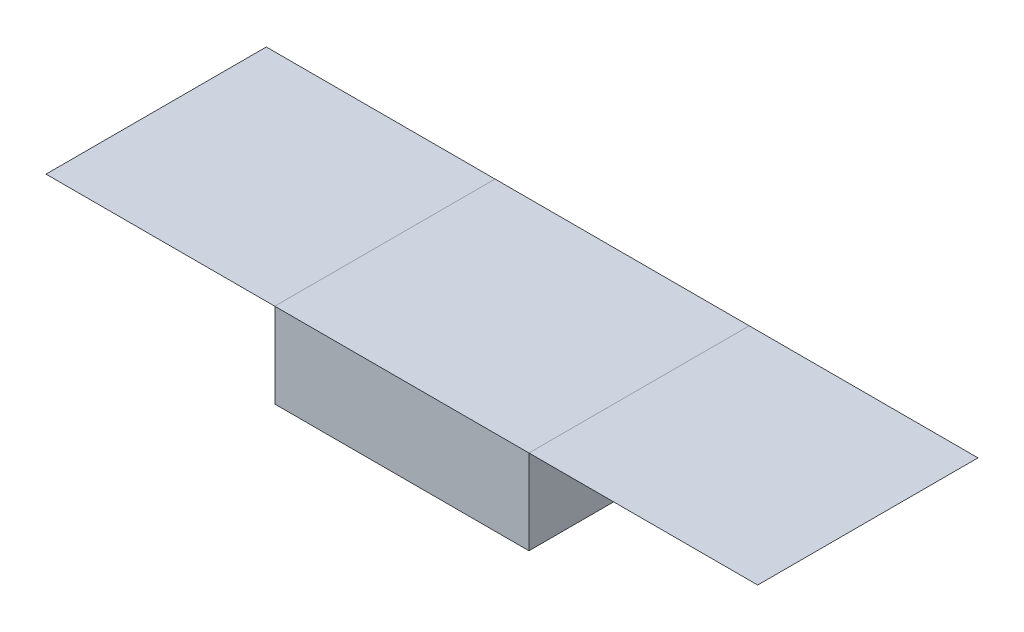
ISO-10303-21;
HEADER;
FILE_DESCRIPTION(('STEP AP214'),'2;1');
FILE_NAME('part.step','',(''),(''),'','','');
FILE_SCHEMA(('AUTOMOTIVE_DESIGN { 1 0 10303 214 1 1 1 1 }'));
ENDSEC;
DATA;
#1=APPLICATION_CONTEXT('core data for automotive mechanical design processes');
#2=APPLICATION_PROTOCOL_DEFINITION('international standard','automotive_design',2000,#1);
#3=PRODUCT_CONTEXT('',#1,'mechanical');
#4=PRODUCT('Part','Part','',(#3));
#5=PRODUCT_RELATED_PRODUCT_CATEGORY('part','',(#4));
#6=PRODUCT_DEFINITION_FORMATION('','',#4);
#7=PRODUCT_DEFINITION_CONTEXT('part definition',#1,'design');
#8=PRODUCT_DEFINITION('design','',#6,#7);
#9=PRODUCT_DEFINITION_SHAPE('','',#8);
#10=(LENGTH_UNIT() NAMED_UNIT(*) SI_UNIT(.MILLI.,.METRE.));
#11=(NAMED_UNIT(*) PLANE_ANGLE_UNIT() SI_UNIT($,.RADIAN.));
#12=(NAMED_UNIT(*) SI_UNIT($,.STERADIAN.) SOLID_ANGLE_UNIT());
#13=UNCERTAINTY_MEASURE_WITH_UNIT(LENGTH_MEASURE(1.E-05),#10,'distance_accuracy_value','');
#14=(GEOMETRIC_REPRESENTATION_CONTEXT(3) GLOBAL_UNCERTAINTY_ASSIGNED_CONTEXT((#13)) GLOBAL_UNIT_ASSIGNED_CONTEXT((#10,
#11,#12)) REPRESENTATION_CONTEXT('',''));
#15=CARTESIAN_POINT('',(0.,0.,0.));
#16=DIRECTION('',(0.,0.,1.));
#17=DIRECTION('',(1.,0.,0.));
#18=AXIS2_PLACEMENT_3D('',#15,#16,#17);
#19=CARTESIAN_POINT('',(21.85,0.,12.5));
#20=DIRECTION('',(0.,-1.,0.));
#21=DIRECTION('',(0.,0.,-1.));
#22=AXIS2_PLACEMENT_3D('',#19,#20,#21);
#23=PLANE('',#22);
#24=DIRECTION('',(0.,0.,-1.));
#25=VECTOR('',#24,1.);
#26=CARTESIAN_POINT('',(11.5,-3.21735518120857E-13,23.7));
#27=LINE('',#26,#25);
#28=CARTESIAN_POINT('',(11.5,-1.60867759060428E-13,23.7));
#29=VERTEX_POINT('',#28);
#30=CARTESIAN_POINT('',(11.5,-1.60867759060428E-13,25.));
#31=VERTEX_POINT('',#30);
#32=EDGE_CURVE('P0_E79',#29,#31,#27,.F.);
#33=ORIENTED_EDGE('',*,*,#32,.F.);
#34=DIRECTION('',(-1.,0.,0.));
#35=VECTOR('',#34,1.);
#36=CARTESIAN_POINT('',(10.,-3.21735518120857E-13,23.7));
#37=LINE('',#36,#35);
#38=CARTESIAN_POINT('',(10.,0.,23.7));
#39=VERTEX_POINT('',#38);
#40=EDGE_CURVE('P0_E55',#39,#29,#37,.F.);
#41=ORIENTED_EDGE('',*,*,#40,.F.);
#42=DIRECTION('',(0.,0.,1.));
#43=VECTOR('',#42,1.);
#44=CARTESIAN_POINT('',(10.,0.,25.));
#45=LINE('',#44,#43);
#46=CARTESIAN_POINT('',(10.,0.,25.));
#47=VERTEX_POINT('',#46);
#48=EDGE_CURVE('P0_E57',#47,#39,#45,.F.);
#49=ORIENTED_EDGE('',*,*,#48,.F.);
#50=DIRECTION('',(1.,0.,0.));
#51=VECTOR('',#50,1.);
#52=CARTESIAN_POINT('',(11.5,-3.21735518120857E-13,25.));
#53=LINE('',#52,#51);
#54=EDGE_CURVE('P0_E20',#31,#47,#53,.F.);
#55=ORIENTED_EDGE('',*,*,#54,.F.);
#56=EDGE_LOOP('',(#33,#41,#49,#55));
#57=FACE_BOUND('',#56,.T.);
#58=ADVANCED_FACE('P0_F17',(#57),#23,.F.);
#59=CARTESIAN_POINT('',(11.5,-3.21735518120857E-13,25.));
#60=DIRECTION('',(0.,0.,1.));
#61=DIRECTION('',(1.,0.,0.));
#62=AXIS2_PLACEMENT_3D('',#59,#60,#61);
#63=PLANE('',#62);
#64=DIRECTION('',(1.,0.,0.));
#65=VECTOR('',#64,1.);
#66=CARTESIAN_POINT('',(21.85,-0.5,25.));
#67=LINE('',#66,#65);
#68=CARTESIAN_POINT('',(11.5,-0.50000000000008,25.));
#69=VERTEX_POINT('',#68);
#70=CARTESIAN_POINT('',(10.,-0.50000000000008,25.));
#71=VERTEX_POINT('',#70);
#72=EDGE_CURVE('P0_E83',#69,#71,#67,.F.);
#73=ORIENTED_EDGE('',*,*,#72,.F.);
#74=DIRECTION('',(0.,1.,0.));
#75=VECTOR('',#74,1.);
#76=CARTESIAN_POINT('',(11.5,-3.21735518120857E-13,25.));
#77=LINE('',#76,#75);
#78=EDGE_CURVE('P0_E68',#31,#69,#77,.F.);
#79=ORIENTED_EDGE('',*,*,#78,.F.);
#80=ORIENTED_EDGE('',*,*,#54,.T.);
#81=DIRECTION('',(0.,1.,0.));
#82=VECTOR('',#81,1.);
#83=CARTESIAN_POINT('',(10.,0.,25.));
#84=LINE('',#83,#82);
#85=EDGE_CURVE('P0_E63',#71,#47,#84,.T.);
#86=ORIENTED_EDGE('',*,*,#85,.F.);
#87=EDGE_LOOP('',(#73,#79,#80,#86));
#88=FACE_BOUND('',#87,.T.);
#89=ADVANCED_FACE('P0_F65',(#88),#63,.T.);
#90=CARTESIAN_POINT('',(10.,0.,25.));
#91=DIRECTION('',(-1.,0.,0.));
#92=DIRECTION('',(0.,0.,1.));
#93=AXIS2_PLACEMENT_3D('',#90,#91,#92);
#94=PLANE('',#93);
#95=DIRECTION('',(0.,0.,-1.));
#96=VECTOR('',#95,1.);
#97=CARTESIAN_POINT('',(10.,-0.5,12.5));
#98=LINE('',#97,#96);
#99=CARTESIAN_POINT('',(10.,-0.500000000000242,23.7));
#100=VERTEX_POINT('',#99);
#101=EDGE_CURVE('P0_E72',#71,#100,#98,.T.);
#102=ORIENTED_EDGE('',*,*,#101,.F.);
#103=ORIENTED_EDGE('',*,*,#85,.T.);
#104=ORIENTED_EDGE('',*,*,#48,.T.);
#105=DIRECTION('',(0.,1.,0.));
#106=VECTOR('',#105,1.);
#107=CARTESIAN_POINT('',(10.,-3.21735518120857E-13,23.7));
#108=LINE('',#107,#106);
#109=EDGE_CURVE('P0_E75',#100,#39,#108,.T.);
#110=ORIENTED_EDGE('',*,*,#109,.F.);
#111=EDGE_LOOP('',(#102,#103,#104,#110));
#112=FACE_BOUND('',#111,.T.);
#113=ADVANCED_FACE('P0_F70',(#112),#94,.T.);
#114=CARTESIAN_POINT('',(10.,-3.21735518120857E-13,23.7));
#115=DIRECTION('',(0.,0.,-1.));
#116=DIRECTION('',(-1.,0.,0.));
#117=AXIS2_PLACEMENT_3D('',#114,#115,#116);
#118=PLANE('',#117);
#119=DIRECTION('',(1.,0.,0.));
#120=VECTOR('',#119,1.);
#121=CARTESIAN_POINT('',(21.85,-0.5,23.7));
#122=LINE('',#121,#120);
#123=CARTESIAN_POINT('',(11.5,-0.500000000000242,23.7));
#124=VERTEX_POINT('',#123);
#125=EDGE_CURVE('P0_E26',#100,#124,#122,.T.);
#126=ORIENTED_EDGE('',*,*,#125,.F.);
#127=ORIENTED_EDGE('',*,*,#109,.T.);
#128=ORIENTED_EDGE('',*,*,#40,.T.);
#129=DIRECTION('',(0.,1.,0.));
#130=VECTOR('',#129,1.);
#131=CARTESIAN_POINT('',(11.5,-3.21735518120857E-13,23.7));
#132=LINE('',#131,#130);
#133=EDGE_CURVE('P0_E35',#124,#29,#132,.T.);
#134=ORIENTED_EDGE('',*,*,#133,.F.);
#135=EDGE_LOOP('',(#126,#127,#128,#134));
#136=FACE_BOUND('',#135,.T.);
#137=ADVANCED_FACE('P0_F89',(#136),#118,.T.);
#138=CARTESIAN_POINT('',(11.5,-3.21735518120857E-13,23.7));
#139=DIRECTION('',(1.,0.,0.));
#140=DIRECTION('',(0.,0.,-1.));
#141=AXIS2_PLACEMENT_3D('',#138,#139,#140);
#142=PLANE('',#141);
#143=DIRECTION('',(0.,0.,-1.));
#144=VECTOR('',#143,1.);
#145=CARTESIAN_POINT('',(11.5,-0.5,12.5));
#146=LINE('',#145,#144);
#147=EDGE_CURVE('P0_E11',#124,#69,#146,.F.);
#148=ORIENTED_EDGE('',*,*,#147,.F.);
#149=ORIENTED_EDGE('',*,*,#133,.T.);
#150=ORIENTED_EDGE('',*,*,#32,.T.);
#151=ORIENTED_EDGE('',*,*,#78,.T.);
#152=EDGE_LOOP('',(#148,#149,#150,#151));
#153=FACE_BOUND('',#152,.T.);
#154=ADVANCED_FACE('P0_F91',(#153),#142,.T.);
#155=CARTESIAN_POINT('',(21.85,-0.5,12.5));
#156=DIRECTION('',(0.,-1.,0.));
#157=DIRECTION('',(0.,0.,-1.));
#158=AXIS2_PLACEMENT_3D('',#155,#156,#157);
#159=PLANE('',#158);
#160=ORIENTED_EDGE('',*,*,#125,.T.);
#161=ORIENTED_EDGE('',*,*,#147,.T.);
#162=ORIENTED_EDGE('',*,*,#72,.T.);
#163=ORIENTED_EDGE('',*,*,#101,.T.);
#164=EDGE_LOOP('',(#160,#161,#162,#163));
#165=FACE_BOUND('',#164,.T.);
#166=ADVANCED_FACE('P0_F88',(#165),#159,.T.);
#167=CLOSED_SHELL('',(#58,#89,#113,#137,#154,#166));
#168=MANIFOLD_SOLID_BREP('P0_B1',#167);
#169=CARTESIAN_POINT('',(21.85,-0.1,12.5));
#170=DIRECTION('',(0.,-1.,0.));
#171=DIRECTION('',(0.,0.,-1.));
#172=AXIS2_PLACEMENT_3D('',#169,#170,#171);
#173=PLANE('',#172);
#174=DIRECTION('',(1.,0.,0.));
#175=VECTOR('',#174,1.);
#176=CARTESIAN_POINT('',(11.5,-0.1,24.3755002001611));
#177=LINE('',#176,#175);
#178=CARTESIAN_POINT('',(11.5,-0.100000000000161,24.3755002001611));
#179=VERTEX_POINT('',#178);
#180=CARTESIAN_POINT('',(12.2255002001611,-0.1,24.3755002001611));
#181=VERTEX_POINT('',#180);
#182=EDGE_CURVE('P1_E64',#179,#181,#177,.T.);
#183=ORIENTED_EDGE('',*,*,#182,.F.);
#184=DIRECTION('',(0.,0.,1.));
#185=VECTOR('',#184,1.);
#186=CARTESIAN_POINT('',(11.5,-0.100000000000322,25.));
#187=LINE('',#186,#185);
#188=CARTESIAN_POINT('',(11.5,-0.100000000000161,24.3244997998389));
#189=VERTEX_POINT('',#188);
#190=EDGE_CURVE('P1_E59',#189,#179,#187,.T.);
#191=ORIENTED_EDGE('',*,*,#190,.F.);
#192=DIRECTION('',(-1.,0.,0.));
#193=VECTOR('',#192,1.);
#194=CARTESIAN_POINT('',(12.85,-0.1,24.3244997998389));
#195=LINE('',#194,#193);
#196=CARTESIAN_POINT('',(12.2255002001611,-0.1,24.3244997998389));
#197=VERTEX_POINT('',#196);
#198=EDGE_CURVE('P1_E49',#197,#189,#195,.T.);
#199=ORIENTED_EDGE('',*,*,#198,.F.);
#200=DIRECTION('',(0.,0.,-1.));
#201=VECTOR('',#200,1.);
#202=CARTESIAN_POINT('',(12.2255002001611,-0.1,25.));
#203=LINE('',#202,#201);
#204=EDGE_CURVE('P1_E73',#181,#197,#203,.T.);
#205=ORIENTED_EDGE('',*,*,#204,.F.);
#206=EDGE_LOOP('',(#183,#191,#199,#205));
#207=FACE_BOUND('',#206,.T.);
#208=ADVANCED_FACE('P1_F17',(#207),#173,.T.);
#209=CARTESIAN_POINT('',(11.5,-3.21735518120857E-13,25.));
#210=DIRECTION('',(-1.,0.,0.));
#211=DIRECTION('',(0.,0.,1.));
#212=AXIS2_PLACEMENT_3D('',#209,#210,#211);
#213=PLANE('',#212);
#214=CARTESIAN_POINT('',(11.5,1.9,24.3755002001611));
#215=DIRECTION('',(1.,0.,0.));
#216=DIRECTION('',(0.,0.,-1.));
#217=AXIS2_PLACEMENT_3D('',#214,#215,#216);
#218=CIRCLE('',#217,2.);
#219=CARTESIAN_POINT('',(11.5,0.,25.0000000000005));
#220=VERTEX_POINT('',#219);
#221=EDGE_CURVE('P1_E80',#220,#179,#218,.T.);
#222=ORIENTED_EDGE('',*,*,#221,.F.);
#223=DIRECTION('',(0.,0.,-1.));
#224=VECTOR('',#223,1.);
#225=CARTESIAN_POINT('',(11.5,0.,12.5));
#226=LINE('',#225,#224);
#227=CARTESIAN_POINT('',(11.5,0.,23.6999999999995));
#228=VERTEX_POINT('',#227);
#229=EDGE_CURVE('P1_E72',#220,#228,#226,.T.);
#230=ORIENTED_EDGE('',*,*,#229,.T.);
#231=CARTESIAN_POINT('',(11.5,1.9,24.3244997998389));
#232=DIRECTION('',(-1.,0.,0.));
#233=DIRECTION('',(0.,0.,1.));
#234=AXIS2_PLACEMENT_3D('',#231,#232,#233);
#235=CIRCLE('',#234,2.);
#236=EDGE_CURVE('P1_E20',#189,#228,#235,.F.);
#237=ORIENTED_EDGE('',*,*,#236,.F.);
#238=ORIENTED_EDGE('',*,*,#190,.T.);
#239=EDGE_LOOP('',(#222,#230,#237,#238));
#240=FACE_BOUND('',#239,.T.);
#241=ADVANCED_FACE('P1_F70',(#240),#213,.T.);
#242=CARTESIAN_POINT('',(12.85,1.9,24.3244997998389));
#243=DIRECTION('',(-1.,0.,0.));
#244=DIRECTION('',(0.,0.,1.));
#245=AXIS2_PLACEMENT_3D('',#242,#243,#244);
#246=CYLINDRICAL_SURFACE('',#245,2.);
#247=ORIENTED_EDGE('',*,*,#236,.T.);
#248=DIRECTION('',(1.,0.,0.));
#249=VECTOR('',#248,1.);
#250=CARTESIAN_POINT('',(21.85,0.,23.7));
#251=LINE('',#250,#249);
#252=CARTESIAN_POINT('',(12.85,0.,23.7));
#253=VERTEX_POINT('',#252);
#254=EDGE_CURVE('P1_E82',#228,#253,#251,.T.);
#255=ORIENTED_EDGE('',*,*,#254,.T.);
#256=CARTESIAN_POINT('',(12.2255002001611,1.9,24.3244997998389));
#257=DIRECTION('',(-0.707106781186547,0.,-0.707106781186547));
#258=DIRECTION('',(0.707106781186547,0.,-0.707106781186547));
#259=AXIS2_PLACEMENT_3D('',#256,#257,#258);
#260=ELLIPSE('',#259,2.82842712474619,2.);
#261=EDGE_CURVE('P1_E55',#197,#253,#260,.F.);
#262=ORIENTED_EDGE('',*,*,#261,.F.);
#263=ORIENTED_EDGE('',*,*,#198,.T.);
#264=EDGE_LOOP('',(#247,#255,#262,#263));
#265=FACE_BOUND('',#264,.T.);
#266=ADVANCED_FACE('P1_F51',(#265),#246,.T.);
#267=CARTESIAN_POINT('',(12.2255002001611,1.9,25.));
#268=DIRECTION('',(0.,0.,-1.));
#269=DIRECTION('',(-1.,0.,0.));
#270=AXIS2_PLACEMENT_3D('',#267,#268,#269);
#271=CYLINDRICAL_SURFACE('',#270,2.);
#272=CARTESIAN_POINT('',(12.2255002001611,1.9,24.3755002001611));
#273=DIRECTION('',(0.707106781186547,0.,-0.707106781186547));
#274=DIRECTION('',(0.707106781186547,0.,0.707106781186547));
#275=AXIS2_PLACEMENT_3D('',#272,#273,#274);
#276=ELLIPSE('',#275,2.82842712474619,2.);
#277=CARTESIAN_POINT('',(12.85,0.,25.));
#278=VERTEX_POINT('',#277);
#279=EDGE_CURVE('P1_E34',#181,#278,#276,.F.);
#280=ORIENTED_EDGE('',*,*,#279,.F.);
#281=ORIENTED_EDGE('',*,*,#204,.T.);
#282=ORIENTED_EDGE('',*,*,#261,.T.);
#283=DIRECTION('',(0.,0.,-1.));
#284=VECTOR('',#283,1.);
#285=CARTESIAN_POINT('',(12.85,0.,12.5));
#286=LINE('',#285,#284);
#287=EDGE_CURVE('P1_E26',#253,#278,#286,.F.);
#288=ORIENTED_EDGE('',*,*,#287,.T.);
#289=EDGE_LOOP('',(#280,#281,#282,#288));
#290=FACE_BOUND('',#289,.T.);
#291=ADVANCED_FACE('P1_F87',(#290),#271,.T.);
#292=CARTESIAN_POINT('',(11.5,1.9,24.3755002001611));
#293=DIRECTION('',(1.,0.,0.));
#294=DIRECTION('',(0.,0.,-1.));
#295=AXIS2_PLACEMENT_3D('',#292,#293,#294);
#296=CYLINDRICAL_SURFACE('',#295,2.);
#297=ORIENTED_EDGE('',*,*,#221,.T.);
#298=ORIENTED_EDGE('',*,*,#182,.T.);
#299=ORIENTED_EDGE('',*,*,#279,.T.);
#300=DIRECTION('',(1.,0.,0.));
#301=VECTOR('',#300,1.);
#302=CARTESIAN_POINT('',(21.85,0.,25.));
#303=LINE('',#302,#301);
#304=EDGE_CURVE('P1_E11',#278,#220,#303,.F.);
#305=ORIENTED_EDGE('',*,*,#304,.T.);
#306=EDGE_LOOP('',(#297,#298,#299,#305));
#307=FACE_BOUND('',#306,.T.);
#308=ADVANCED_FACE('P1_F86',(#307),#296,.T.);
#309=CARTESIAN_POINT('',(21.85,0.,12.5));
#310=DIRECTION('',(0.,-1.,0.));
#311=DIRECTION('',(0.,0.,-1.));
#312=AXIS2_PLACEMENT_3D('',#309,#310,#311);
#313=PLANE('',#312);
#314=ORIENTED_EDGE('',*,*,#287,.F.);
#315=ORIENTED_EDGE('',*,*,#254,.F.);
#316=ORIENTED_EDGE('',*,*,#229,.F.);
#317=ORIENTED_EDGE('',*,*,#304,.F.);
#318=EDGE_LOOP('',(#314,#315,#316,#317));
#319=FACE_BOUND('',#318,.T.);
#320=ADVANCED_FACE('P1_F89',(#319),#313,.F.);
#321=CLOSED_SHELL('',(#208,#241,#266,#291,#308,#320));
#322=MANIFOLD_SOLID_BREP('P1_B1',#321);
#323=CARTESIAN_POINT('',(21.85,-0.1,12.5));
#324=DIRECTION('',(0.,-1.,0.));
#325=DIRECTION('',(0.,0.,-1.));
#326=AXIS2_PLACEMENT_3D('',#323,#324,#325);
#327=PLANE('',#326);
#328=DIRECTION('',(-1.,0.,0.));
#329=VECTOR('',#328,1.);
#330=CARTESIAN_POINT('',(8.65,-0.1,24.3244997998374));
#331=LINE('',#330,#329);
#332=CARTESIAN_POINT('',(10.,-0.100000000000077,24.3244997998374));
#333=VERTEX_POINT('',#332);
#334=CARTESIAN_POINT('',(9.27449979983738,-0.1,24.3244997998374));
#335=VERTEX_POINT('',#334);
#336=EDGE_CURVE('P2_E71',#333,#335,#331,.T.);
#337=ORIENTED_EDGE('',*,*,#336,.F.);
#338=DIRECTION('',(0.,0.,-1.));
#339=VECTOR('',#338,1.);
#340=CARTESIAN_POINT('',(10.,-0.100000000000155,23.7));
#341=LINE('',#340,#339);
#342=CARTESIAN_POINT('',(10.,-0.100000000000078,24.3755002001602));
#343=VERTEX_POINT('',#342);
#344=EDGE_CURVE('P2_E59',#343,#333,#341,.T.);
#345=ORIENTED_EDGE('',*,*,#344,.F.);
#346=DIRECTION('',(1.,0.,0.));
#347=VECTOR('',#346,1.);
#348=CARTESIAN_POINT('',(10.,-0.1,24.3755002001602));
#349=LINE('',#348,#347);
#350=CARTESIAN_POINT('',(9.27449979983738,-0.1,24.3755002001602));
#351=VERTEX_POINT('',#350);
#352=EDGE_CURVE('P2_E54',#351,#343,#349,.T.);
#353=ORIENTED_EDGE('',*,*,#352,.F.);
#354=DIRECTION('',(0.,0.,1.));
#355=VECTOR('',#354,1.);
#356=CARTESIAN_POINT('',(9.27449979983738,-0.1,25.));
#357=LINE('',#356,#355);
#358=EDGE_CURVE('P2_E57',#335,#351,#357,.T.);
#359=ORIENTED_EDGE('',*,*,#358,.F.);
#360=EDGE_LOOP('',(#337,#345,#353,#359));
#361=FACE_BOUND('',#360,.T.);
#362=ADVANCED_FACE('P2_F17',(#361),#327,.T.);
#363=CARTESIAN_POINT('',(10.,1.9,24.3755002001602));
#364=DIRECTION('',(1.,0.,0.));
#365=DIRECTION('',(0.,0.,-1.));
#366=AXIS2_PLACEMENT_3D('',#363,#364,#365);
#367=CYLINDRICAL_SURFACE('',#366,2.);
#368=CARTESIAN_POINT('',(10.,1.9,24.3755002001602));
#369=DIRECTION('',(1.,0.,0.));
#370=DIRECTION('',(0.,0.,-1.));
#371=AXIS2_PLACEMENT_3D('',#368,#369,#370);
#372=CIRCLE('',#371,2.);
#373=CARTESIAN_POINT('',(10.,0.,25.));
#374=VERTEX_POINT('',#373);
#375=EDGE_CURVE('P2_E76',#374,#343,#372,.T.);
#376=ORIENTED_EDGE('',*,*,#375,.F.);
#377=DIRECTION('',(1.,0.,0.));
#378=VECTOR('',#377,1.);
#379=CARTESIAN_POINT('',(21.85,0.,25.));
#380=LINE('',#379,#378);
#381=CARTESIAN_POINT('',(8.64999999999879,0.,24.9999999999988));
#382=VERTEX_POINT('',#381);
#383=EDGE_CURVE('P2_E75',#374,#382,#380,.F.);
#384=ORIENTED_EDGE('',*,*,#383,.T.);
#385=CARTESIAN_POINT('',(9.27449979983738,1.9,24.3755002001602));
#386=DIRECTION('',(0.707106781186547,0.,0.707106781186547));
#387=DIRECTION('',(-0.707106781186547,0.,0.707106781186547));
#388=AXIS2_PLACEMENT_3D('',#385,#386,#387);
#389=ELLIPSE('',#388,2.82842712474619,2.);
#390=EDGE_CURVE('P2_E20',#351,#382,#389,.F.);
#391=ORIENTED_EDGE('',*,*,#390,.F.);
#392=ORIENTED_EDGE('',*,*,#352,.T.);
#393=EDGE_LOOP('',(#376,#384,#391,#392));
#394=FACE_BOUND('',#393,.T.);
#395=ADVANCED_FACE('P2_F74',(#394),#367,.T.);
#396=CARTESIAN_POINT('',(9.27449979983738,1.9,25.));
#397=DIRECTION('',(0.,0.,1.));
#398=DIRECTION('',(1.,0.,0.));
#399=AXIS2_PLACEMENT_3D('',#396,#397,#398);
#400=CYLINDRICAL_SURFACE('',#399,2.);
#401=CARTESIAN_POINT('',(9.27449979983738,1.9,24.3244997998374));
#402=DIRECTION('',(-0.707106781186547,0.,0.707106781186547));
#403=DIRECTION('',(-0.707106781186547,0.,-0.707106781186547));
#404=AXIS2_PLACEMENT_3D('',#401,#402,#403);
#405=ELLIPSE('',#404,2.82842712474619,2.);
#406=CARTESIAN_POINT('',(8.64999999999999,0.,23.7));
#407=VERTEX_POINT('',#406);
#408=EDGE_CURVE('P2_E70',#335,#407,#405,.F.);
#409=ORIENTED_EDGE('',*,*,#408,.F.);
#410=ORIENTED_EDGE('',*,*,#358,.T.);
#411=ORIENTED_EDGE('',*,*,#390,.T.);
#412=DIRECTION('',(0.,0.,-1.));
#413=VECTOR('',#412,1.);
#414=CARTESIAN_POINT('',(8.65,0.,12.5));
#415=LINE('',#414,#413);
#416=EDGE_CURVE('P2_E78',#382,#407,#415,.T.);
#417=ORIENTED_EDGE('',*,*,#416,.T.);
#418=EDGE_LOOP('',(#409,#410,#411,#417));
#419=FACE_BOUND('',#418,.T.);
#420=ADVANCED_FACE('P2_F67',(#419),#400,.T.);
#421=CARTESIAN_POINT('',(8.65,1.9,24.3244997998374));
#422=DIRECTION('',(-1.,0.,0.));
#423=DIRECTION('',(0.,0.,1.));
#424=AXIS2_PLACEMENT_3D('',#421,#422,#423);
#425=CYLINDRICAL_SURFACE('',#424,2.);
#426=ORIENTED_EDGE('',*,*,#408,.T.);
#427=DIRECTION('',(1.,0.,0.));
#428=VECTOR('',#427,1.);
#429=CARTESIAN_POINT('',(21.85,0.,23.7));
#430=LINE('',#429,#428);
#431=CARTESIAN_POINT('',(10.,0.,23.6999999999988));
#432=VERTEX_POINT('',#431);
#433=EDGE_CURVE('P2_E26',#407,#432,#430,.T.);
#434=ORIENTED_EDGE('',*,*,#433,.T.);
#435=CARTESIAN_POINT('',(10.,1.9,24.3244997998374));
#436=DIRECTION('',(-1.,0.,0.));
#437=DIRECTION('',(0.,0.,1.));
#438=AXIS2_PLACEMENT_3D('',#435,#436,#437);
#439=CIRCLE('',#438,2.);
#440=EDGE_CURVE('P2_E34',#333,#432,#439,.F.);
#441=ORIENTED_EDGE('',*,*,#440,.F.);
#442=ORIENTED_EDGE('',*,*,#336,.T.);
#443=EDGE_LOOP('',(#426,#434,#441,#442));
#444=FACE_BOUND('',#443,.T.);
#445=ADVANCED_FACE('P2_F88',(#444),#425,.T.);
#446=CARTESIAN_POINT('',(10.,-3.21735518120857E-13,23.7));
#447=DIRECTION('',(1.,0.,0.));
#448=DIRECTION('',(0.,0.,-1.));
#449=AXIS2_PLACEMENT_3D('',#446,#447,#448);
#450=PLANE('',#449);
#451=ORIENTED_EDGE('',*,*,#440,.T.);
#452=DIRECTION('',(0.,0.,-1.));
#453=VECTOR('',#452,1.);
#454=CARTESIAN_POINT('',(10.,0.,12.5));
#455=LINE('',#454,#453);
#456=EDGE_CURVE('P2_E11',#432,#374,#455,.F.);
#457=ORIENTED_EDGE('',*,*,#456,.T.);
#458=ORIENTED_EDGE('',*,*,#375,.T.);
#459=ORIENTED_EDGE('',*,*,#344,.T.);
#460=EDGE_LOOP('',(#451,#457,#458,#459));
#461=FACE_BOUND('',#460,.T.);
#462=ADVANCED_FACE('P2_F91',(#461),#450,.T.);
#463=CARTESIAN_POINT('',(21.85,0.,12.5));
#464=DIRECTION('',(0.,-1.,0.));
#465=DIRECTION('',(0.,0.,-1.));
#466=AXIS2_PLACEMENT_3D('',#463,#464,#465);
#467=PLANE('',#466);
#468=ORIENTED_EDGE('',*,*,#433,.F.);
#469=ORIENTED_EDGE('',*,*,#416,.F.);
#470=ORIENTED_EDGE('',*,*,#383,.F.);
#471=ORIENTED_EDGE('',*,*,#456,.F.);
#472=EDGE_LOOP('',(#468,#469,#470,#471));
#473=FACE_BOUND('',#472,.T.);
#474=ADVANCED_FACE('P2_F89',(#473),#467,.F.);
#475=CLOSED_SHELL('',(#362,#395,#420,#445,#462,#474));
#476=MANIFOLD_SOLID_BREP('P2_B1',#475);
#477=ADVANCED_BREP_SHAPE_REPRESENTATION('',(#18,#168,#322,#476),#14);
#478=SHAPE_DEFINITION_REPRESENTATION(#9,#477);
ENDSEC;
END-ISO-10303-21;
